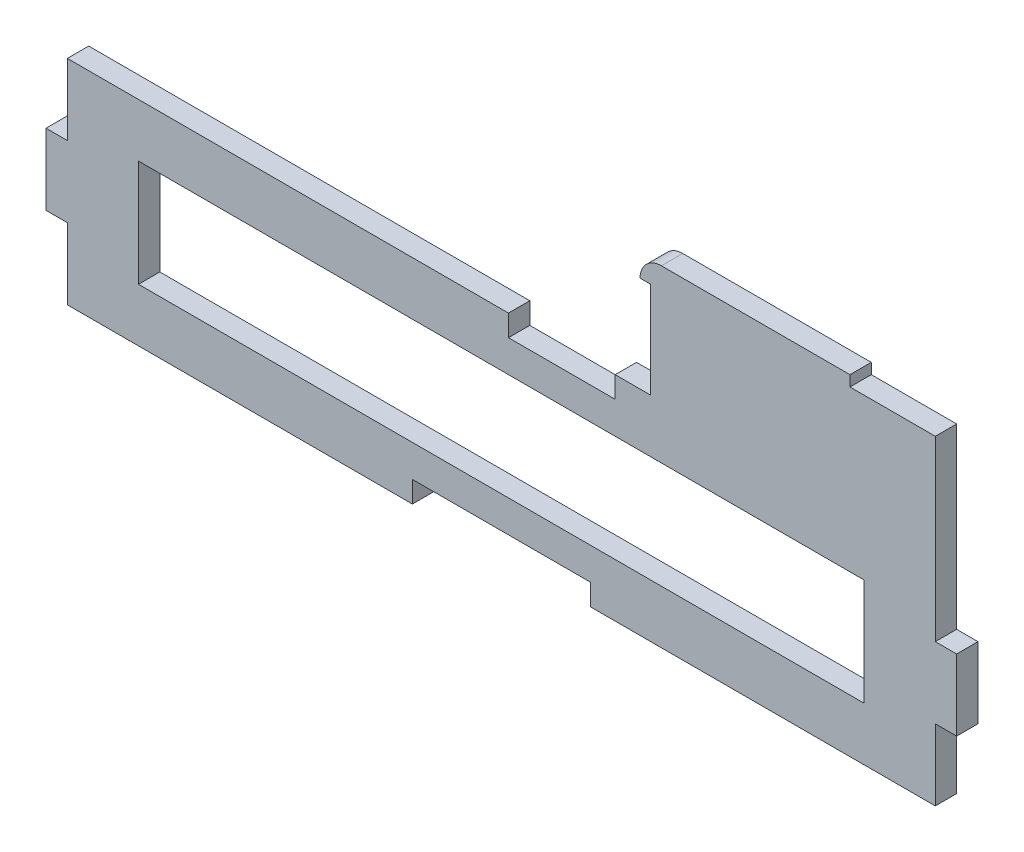
ISO-10303-21;
HEADER;
FILE_DESCRIPTION(('STEP AP214'),'2;1');
FILE_NAME('part.step','',(''),(''),'','','');
FILE_SCHEMA(('AUTOMOTIVE_DESIGN { 1 0 10303 214 1 1 1 1 }'));
ENDSEC;
DATA;
#1=APPLICATION_CONTEXT('core data for automotive mechanical design processes');
#2=APPLICATION_PROTOCOL_DEFINITION('international standard','automotive_design',2000,#1);
#3=PRODUCT_CONTEXT('',#1,'mechanical');
#4=PRODUCT('Part','Part','',(#3));
#5=PRODUCT_RELATED_PRODUCT_CATEGORY('part','',(#4));
#6=PRODUCT_DEFINITION_FORMATION('','',#4);
#7=PRODUCT_DEFINITION_CONTEXT('part definition',#1,'design');
#8=PRODUCT_DEFINITION('design','',#6,#7);
#9=PRODUCT_DEFINITION_SHAPE('','',#8);
#10=(LENGTH_UNIT() NAMED_UNIT(*) SI_UNIT(.MILLI.,.METRE.));
#11=(NAMED_UNIT(*) PLANE_ANGLE_UNIT() SI_UNIT($,.RADIAN.));
#12=(NAMED_UNIT(*) SI_UNIT($,.STERADIAN.) SOLID_ANGLE_UNIT());
#13=UNCERTAINTY_MEASURE_WITH_UNIT(LENGTH_MEASURE(1.E-05),#10,'distance_accuracy_value','');
#14=(GEOMETRIC_REPRESENTATION_CONTEXT(3) GLOBAL_UNCERTAINTY_ASSIGNED_CONTEXT((#13)) GLOBAL_UNIT_ASSIGNED_CONTEXT((#10,
#11,#12)) REPRESENTATION_CONTEXT('',''));
#15=CARTESIAN_POINT('',(0.,0.,0.));
#16=DIRECTION('',(0.,0.,1.));
#17=DIRECTION('',(1.,0.,0.));
#18=AXIS2_PLACEMENT_3D('',#15,#16,#17);
#19=CARTESIAN_POINT('',(167.,87.,6.));
#20=DIRECTION('',(0.,0.,-1.));
#21=DIRECTION('',(-1.,0.,0.));
#22=AXIS2_PLACEMENT_3D('',#19,#20,#21);
#23=CYLINDRICAL_SURFACE('',#22,6.);
#24=DIRECTION('',(0.,0.,-1.));
#25=VECTOR('',#24,1.);
#26=CARTESIAN_POINT('',(161.,87.,6.));
#27=LINE('',#26,#25);
#28=CARTESIAN_POINT('',(161.,87.,6.));
#29=VERTEX_POINT('',#28);
#30=CARTESIAN_POINT('',(161.,87.,0.));
#31=VERTEX_POINT('',#30);
#32=EDGE_CURVE('E490',#29,#31,#27,.T.);
#33=ORIENTED_EDGE('',*,*,#32,.F.);
#34=CARTESIAN_POINT('',(167.,87.,6.));
#35=DIRECTION('',(0.,0.,1.));
#36=DIRECTION('',(1.,0.,0.));
#37=AXIS2_PLACEMENT_3D('',#34,#35,#36);
#38=CIRCLE('',#37,6.);
#39=CARTESIAN_POINT('',(167.,93.,6.));
#40=VERTEX_POINT('',#39);
#41=EDGE_CURVE('E47',#40,#29,#38,.T.);
#42=ORIENTED_EDGE('',*,*,#41,.F.);
#43=DIRECTION('',(0.,0.,-1.));
#44=VECTOR('',#43,1.);
#45=CARTESIAN_POINT('',(167.,93.,6.));
#46=LINE('',#45,#44);
#47=CARTESIAN_POINT('',(167.,93.,0.));
#48=VERTEX_POINT('',#47);
#49=EDGE_CURVE('E542',#48,#40,#46,.F.);
#50=ORIENTED_EDGE('',*,*,#49,.F.);
#51=CARTESIAN_POINT('',(167.,87.,0.));
#52=DIRECTION('',(0.,0.,1.));
#53=DIRECTION('',(1.,0.,0.));
#54=AXIS2_PLACEMENT_3D('',#51,#52,#53);
#55=CIRCLE('',#54,6.);
#56=EDGE_CURVE('E11',#31,#48,#55,.F.);
#57=ORIENTED_EDGE('',*,*,#56,.F.);
#58=EDGE_LOOP('',(#33,#42,#50,#57));
#59=FACE_BOUND('',#58,.T.);
#60=ADVANCED_FACE('F39',(#59),#23,.T.);
#61=CARTESIAN_POINT('',(0.,0.,6.));
#62=DIRECTION('',(0.,0.,1.));
#63=DIRECTION('',(1.,0.,0.));
#64=AXIS2_PLACEMENT_3D('',#61,#62,#63);
#65=PLANE('',#64);
#66=DIRECTION('',(-1.,0.,0.));
#67=VECTOR('',#66,1.);
#68=CARTESIAN_POINT('',(161.,93.,6.));
#69=LINE('',#68,#67);
#70=CARTESIAN_POINT('',(220.,93.,6.));
#71=VERTEX_POINT('',#70);
#72=EDGE_CURVE('E327',#71,#40,#69,.T.);
#73=ORIENTED_EDGE('',*,*,#72,.T.);
#74=ORIENTED_EDGE('',*,*,#41,.T.);
#75=DIRECTION('',(1.,0.,0.));
#76=VECTOR('',#75,1.);
#77=CARTESIAN_POINT('',(164.,87.,6.));
#78=LINE('',#77,#76);
#79=CARTESIAN_POINT('',(164.,87.,6.));
#80=VERTEX_POINT('',#79);
#81=EDGE_CURVE('E331',#29,#80,#78,.T.);
#82=ORIENTED_EDGE('',*,*,#81,.T.);
#83=DIRECTION('',(0.,-1.,0.));
#84=VECTOR('',#83,1.);
#85=CARTESIAN_POINT('',(164.,87.,6.));
#86=LINE('',#85,#84);
#87=CARTESIAN_POINT('',(164.,60.,6.));
#88=VERTEX_POINT('',#87);
#89=EDGE_CURVE('E334',#80,#88,#86,.T.);
#90=ORIENTED_EDGE('',*,*,#89,.T.);
#91=DIRECTION('',(-1.,0.,0.));
#92=VECTOR('',#91,1.);
#93=CARTESIAN_POINT('',(154.,60.,6.));
#94=LINE('',#93,#92);
#95=CARTESIAN_POINT('',(154.,60.,6.));
#96=VERTEX_POINT('',#95);
#97=EDGE_CURVE('E337',#88,#96,#94,.T.);
#98=ORIENTED_EDGE('',*,*,#97,.T.);
#99=DIRECTION('',(0.,-1.,0.));
#100=VECTOR('',#99,1.);
#101=CARTESIAN_POINT('',(154.,60.,6.));
#102=LINE('',#101,#100);
#103=CARTESIAN_POINT('',(154.,54.,6.));
#104=VERTEX_POINT('',#103);
#105=EDGE_CURVE('E340',#96,#104,#102,.T.);
#106=ORIENTED_EDGE('',*,*,#105,.T.);
#107=DIRECTION('',(-1.,0.,0.));
#108=VECTOR('',#107,1.);
#109=CARTESIAN_POINT('',(154.,54.,6.));
#110=LINE('',#109,#108);
#111=CARTESIAN_POINT('',(124.,54.,6.));
#112=VERTEX_POINT('',#111);
#113=EDGE_CURVE('E343',#104,#112,#110,.T.);
#114=ORIENTED_EDGE('',*,*,#113,.T.);
#115=DIRECTION('',(0.,1.,0.));
#116=VECTOR('',#115,1.);
#117=CARTESIAN_POINT('',(124.,54.,6.));
#118=LINE('',#117,#116);
#119=CARTESIAN_POINT('',(124.,60.,6.));
#120=VERTEX_POINT('',#119);
#121=EDGE_CURVE('E346',#112,#120,#118,.T.);
#122=ORIENTED_EDGE('',*,*,#121,.T.);
#123=DIRECTION('',(-1.,0.,0.));
#124=VECTOR('',#123,1.);
#125=CARTESIAN_POINT('',(0.,60.,6.));
#126=LINE('',#125,#124);
#127=CARTESIAN_POINT('',(0.,60.,6.));
#128=VERTEX_POINT('',#127);
#129=EDGE_CURVE('E349',#120,#128,#126,.T.);
#130=ORIENTED_EDGE('',*,*,#129,.T.);
#131=DIRECTION('',(0.,-1.,0.));
#132=VECTOR('',#131,1.);
#133=CARTESIAN_POINT('',(0.,60.,6.));
#134=LINE('',#133,#132);
#135=CARTESIAN_POINT('',(0.,40.,6.));
#136=VERTEX_POINT('',#135);
#137=EDGE_CURVE('E352',#128,#136,#134,.T.);
#138=ORIENTED_EDGE('',*,*,#137,.T.);
#139=DIRECTION('',(-1.,0.,0.));
#140=VECTOR('',#139,1.);
#141=CARTESIAN_POINT('',(0.,40.,6.));
#142=LINE('',#141,#140);
#143=CARTESIAN_POINT('',(-6.,40.,6.));
#144=VERTEX_POINT('',#143);
#145=EDGE_CURVE('E355',#136,#144,#142,.T.);
#146=ORIENTED_EDGE('',*,*,#145,.T.);
#147=DIRECTION('',(0.,-1.,0.));
#148=VECTOR('',#147,1.);
#149=CARTESIAN_POINT('',(-6.,40.,6.));
#150=LINE('',#149,#148);
#151=CARTESIAN_POINT('',(-6.,20.,6.));
#152=VERTEX_POINT('',#151);
#153=EDGE_CURVE('E358',#144,#152,#150,.T.);
#154=ORIENTED_EDGE('',*,*,#153,.T.);
#155=DIRECTION('',(1.,0.,0.));
#156=VECTOR('',#155,1.);
#157=CARTESIAN_POINT('',(0.,20.,6.));
#158=LINE('',#157,#156);
#159=CARTESIAN_POINT('',(0.,20.,6.));
#160=VERTEX_POINT('',#159);
#161=EDGE_CURVE('E361',#152,#160,#158,.T.);
#162=ORIENTED_EDGE('',*,*,#161,.T.);
#163=DIRECTION('',(0.,-1.,0.));
#164=VECTOR('',#163,1.);
#165=CARTESIAN_POINT('',(0.,20.,6.));
#166=LINE('',#165,#164);
#167=CARTESIAN_POINT('',(0.,0.,6.));
#168=VERTEX_POINT('',#167);
#169=EDGE_CURVE('E364',#160,#168,#166,.T.);
#170=ORIENTED_EDGE('',*,*,#169,.T.);
#171=DIRECTION('',(1.,0.,0.));
#172=VECTOR('',#171,1.);
#173=CARTESIAN_POINT('',(0.,0.,6.));
#174=LINE('',#173,#172);
#175=CARTESIAN_POINT('',(97.,0.,6.));
#176=VERTEX_POINT('',#175);
#177=EDGE_CURVE('E289',#168,#176,#174,.T.);
#178=ORIENTED_EDGE('',*,*,#177,.T.);
#179=DIRECTION('',(0.,1.,0.));
#180=VECTOR('',#179,1.);
#181=CARTESIAN_POINT('',(97.,0.,6.));
#182=LINE('',#181,#180);
#183=CARTESIAN_POINT('',(97.,6.,6.));
#184=VERTEX_POINT('',#183);
#185=EDGE_CURVE('E293',#176,#184,#182,.T.);
#186=ORIENTED_EDGE('',*,*,#185,.T.);
#187=DIRECTION('',(1.,0.,0.));
#188=VECTOR('',#187,1.);
#189=CARTESIAN_POINT('',(97.,6.,6.));
#190=LINE('',#189,#188);
#191=CARTESIAN_POINT('',(147.,6.00000000000001,6.));
#192=VERTEX_POINT('',#191);
#193=EDGE_CURVE('E297',#184,#192,#190,.T.);
#194=ORIENTED_EDGE('',*,*,#193,.T.);
#195=DIRECTION('',(0.,-1.,0.));
#196=VECTOR('',#195,1.);
#197=CARTESIAN_POINT('',(147.,6.00000000000001,6.));
#198=LINE('',#197,#196);
#199=CARTESIAN_POINT('',(147.,0.,6.));
#200=VERTEX_POINT('',#199);
#201=EDGE_CURVE('E300',#192,#200,#198,.T.);
#202=ORIENTED_EDGE('',*,*,#201,.T.);
#203=DIRECTION('',(1.,0.,0.));
#204=VECTOR('',#203,1.);
#205=CARTESIAN_POINT('',(147.,0.,6.));
#206=LINE('',#205,#204);
#207=CARTESIAN_POINT('',(244.,0.,6.));
#208=VERTEX_POINT('',#207);
#209=EDGE_CURVE('E303',#200,#208,#206,.T.);
#210=ORIENTED_EDGE('',*,*,#209,.T.);
#211=DIRECTION('',(0.,1.,0.));
#212=VECTOR('',#211,1.);
#213=CARTESIAN_POINT('',(244.,0.,6.));
#214=LINE('',#213,#212);
#215=CARTESIAN_POINT('',(244.,20.,6.));
#216=VERTEX_POINT('',#215);
#217=EDGE_CURVE('E306',#208,#216,#214,.T.);
#218=ORIENTED_EDGE('',*,*,#217,.T.);
#219=DIRECTION('',(1.,0.,0.));
#220=VECTOR('',#219,1.);
#221=CARTESIAN_POINT('',(244.,20.,6.));
#222=LINE('',#221,#220);
#223=CARTESIAN_POINT('',(250.,20.,6.));
#224=VERTEX_POINT('',#223);
#225=EDGE_CURVE('E309',#216,#224,#222,.T.);
#226=ORIENTED_EDGE('',*,*,#225,.T.);
#227=DIRECTION('',(0.,1.,0.));
#228=VECTOR('',#227,1.);
#229=CARTESIAN_POINT('',(250.,40.,6.));
#230=LINE('',#229,#228);
#231=CARTESIAN_POINT('',(250.,40.,6.));
#232=VERTEX_POINT('',#231);
#233=EDGE_CURVE('E312',#224,#232,#230,.T.);
#234=ORIENTED_EDGE('',*,*,#233,.T.);
#235=DIRECTION('',(-1.,0.,0.));
#236=VECTOR('',#235,1.);
#237=CARTESIAN_POINT('',(244.,40.,6.));
#238=LINE('',#237,#236);
#239=CARTESIAN_POINT('',(244.,40.,6.));
#240=VERTEX_POINT('',#239);
#241=EDGE_CURVE('E315',#232,#240,#238,.T.);
#242=ORIENTED_EDGE('',*,*,#241,.T.);
#243=DIRECTION('',(0.,1.,0.));
#244=VECTOR('',#243,1.);
#245=CARTESIAN_POINT('',(244.,90.,6.));
#246=LINE('',#245,#244);
#247=CARTESIAN_POINT('',(244.,90.,6.));
#248=VERTEX_POINT('',#247);
#249=EDGE_CURVE('E318',#240,#248,#246,.T.);
#250=ORIENTED_EDGE('',*,*,#249,.T.);
#251=DIRECTION('',(-1.,0.,0.));
#252=VECTOR('',#251,1.);
#253=CARTESIAN_POINT('',(220.,90.,6.));
#254=LINE('',#253,#252);
#255=CARTESIAN_POINT('',(220.,90.,6.));
#256=VERTEX_POINT('',#255);
#257=EDGE_CURVE('E321',#248,#256,#254,.T.);
#258=ORIENTED_EDGE('',*,*,#257,.T.);
#259=DIRECTION('',(0.,1.,0.));
#260=VECTOR('',#259,1.);
#261=CARTESIAN_POINT('',(220.,93.,6.));
#262=LINE('',#261,#260);
#263=EDGE_CURVE('E324',#256,#71,#262,.T.);
#264=ORIENTED_EDGE('',*,*,#263,.T.);
#265=EDGE_LOOP('',(#73,#74,#82,#90,#98,#106,#114,#122,#130,#138,#146,#154,#162,#170,#178,#186,
#194,#202,#210,#218,#226,#234,#242,#250,#258,#264));
#266=FACE_BOUND('',#265,.T.);
#267=DIRECTION('',(1.,0.,0.));
#268=VECTOR('',#267,1.);
#269=CARTESIAN_POINT('',(20.,15.,6.));
#270=LINE('',#269,#268);
#271=CARTESIAN_POINT('',(20.,15.,6.));
#272=VERTEX_POINT('',#271);
#273=CARTESIAN_POINT('',(224.,15.,6.));
#274=VERTEX_POINT('',#273);
#275=EDGE_CURVE('E246',#272,#274,#270,.T.);
#276=ORIENTED_EDGE('',*,*,#275,.F.);
#277=DIRECTION('',(0.,-1.,0.));
#278=VECTOR('',#277,1.);
#279=CARTESIAN_POINT('',(20.,15.,6.));
#280=LINE('',#279,#278);
#281=CARTESIAN_POINT('',(20.,45.,6.));
#282=VERTEX_POINT('',#281);
#283=EDGE_CURVE('E235',#282,#272,#280,.T.);
#284=ORIENTED_EDGE('',*,*,#283,.F.);
#285=DIRECTION('',(-1.,0.,0.));
#286=VECTOR('',#285,1.);
#287=CARTESIAN_POINT('',(20.,45.,6.));
#288=LINE('',#287,#286);
#289=CARTESIAN_POINT('',(224.,45.,6.));
#290=VERTEX_POINT('',#289);
#291=EDGE_CURVE('E265',#290,#282,#288,.T.);
#292=ORIENTED_EDGE('',*,*,#291,.F.);
#293=DIRECTION('',(0.,1.,0.));
#294=VECTOR('',#293,1.);
#295=CARTESIAN_POINT('',(224.,15.,6.));
#296=LINE('',#295,#294);
#297=EDGE_CURVE('E261',#274,#290,#296,.T.);
#298=ORIENTED_EDGE('',*,*,#297,.F.);
#299=EDGE_LOOP('',(#276,#284,#292,#298));
#300=FACE_BOUND('',#299,.T.);
#301=ADVANCED_FACE('F259',(#266,#300),#65,.T.);
#302=CARTESIAN_POINT('',(0.,0.,0.));
#303=DIRECTION('',(0.,0.,1.));
#304=DIRECTION('',(1.,0.,0.));
#305=AXIS2_PLACEMENT_3D('',#302,#303,#304);
#306=PLANE('',#305);
#307=DIRECTION('',(1.,0.,0.));
#308=VECTOR('',#307,1.);
#309=CARTESIAN_POINT('',(164.,87.,0.));
#310=LINE('',#309,#308);
#311=CARTESIAN_POINT('',(164.,87.,0.));
#312=VERTEX_POINT('',#311);
#313=EDGE_CURVE('E408',#31,#312,#310,.T.);
#314=ORIENTED_EDGE('',*,*,#313,.F.);
#315=ORIENTED_EDGE('',*,*,#56,.T.);
#316=DIRECTION('',(-1.,0.,0.));
#317=VECTOR('',#316,1.);
#318=CARTESIAN_POINT('',(161.,93.,0.));
#319=LINE('',#318,#317);
#320=CARTESIAN_POINT('',(220.,93.,0.));
#321=VERTEX_POINT('',#320);
#322=EDGE_CURVE('E404',#321,#48,#319,.T.);
#323=ORIENTED_EDGE('',*,*,#322,.F.);
#324=DIRECTION('',(0.,1.,0.));
#325=VECTOR('',#324,1.);
#326=CARTESIAN_POINT('',(220.,93.,0.));
#327=LINE('',#326,#325);
#328=CARTESIAN_POINT('',(220.,90.,0.));
#329=VERTEX_POINT('',#328);
#330=EDGE_CURVE('E401',#329,#321,#327,.T.);
#331=ORIENTED_EDGE('',*,*,#330,.F.);
#332=DIRECTION('',(-1.,0.,0.));
#333=VECTOR('',#332,1.);
#334=CARTESIAN_POINT('',(220.,90.,0.));
#335=LINE('',#334,#333);
#336=CARTESIAN_POINT('',(244.,90.,0.));
#337=VERTEX_POINT('',#336);
#338=EDGE_CURVE('E398',#337,#329,#335,.T.);
#339=ORIENTED_EDGE('',*,*,#338,.F.);
#340=DIRECTION('',(0.,1.,0.));
#341=VECTOR('',#340,1.);
#342=CARTESIAN_POINT('',(244.,90.,0.));
#343=LINE('',#342,#341);
#344=CARTESIAN_POINT('',(244.,40.,0.));
#345=VERTEX_POINT('',#344);
#346=EDGE_CURVE('E395',#345,#337,#343,.T.);
#347=ORIENTED_EDGE('',*,*,#346,.F.);
#348=DIRECTION('',(-1.,0.,0.));
#349=VECTOR('',#348,1.);
#350=CARTESIAN_POINT('',(244.,40.,0.));
#351=LINE('',#350,#349);
#352=CARTESIAN_POINT('',(250.,40.,0.));
#353=VERTEX_POINT('',#352);
#354=EDGE_CURVE('E392',#353,#345,#351,.T.);
#355=ORIENTED_EDGE('',*,*,#354,.F.);
#356=DIRECTION('',(0.,1.,0.));
#357=VECTOR('',#356,1.);
#358=CARTESIAN_POINT('',(250.,40.,0.));
#359=LINE('',#358,#357);
#360=CARTESIAN_POINT('',(250.,20.,0.));
#361=VERTEX_POINT('',#360);
#362=EDGE_CURVE('E389',#361,#353,#359,.T.);
#363=ORIENTED_EDGE('',*,*,#362,.F.);
#364=DIRECTION('',(1.,0.,0.));
#365=VECTOR('',#364,1.);
#366=CARTESIAN_POINT('',(244.,20.,0.));
#367=LINE('',#366,#365);
#368=CARTESIAN_POINT('',(244.,20.,0.));
#369=VERTEX_POINT('',#368);
#370=EDGE_CURVE('E386',#369,#361,#367,.T.);
#371=ORIENTED_EDGE('',*,*,#370,.F.);
#372=DIRECTION('',(0.,1.,0.));
#373=VECTOR('',#372,1.);
#374=CARTESIAN_POINT('',(244.,0.,0.));
#375=LINE('',#374,#373);
#376=CARTESIAN_POINT('',(244.,0.,0.));
#377=VERTEX_POINT('',#376);
#378=EDGE_CURVE('E383',#377,#369,#375,.T.);
#379=ORIENTED_EDGE('',*,*,#378,.F.);
#380=DIRECTION('',(1.,0.,0.));
#381=VECTOR('',#380,1.);
#382=CARTESIAN_POINT('',(147.,0.,0.));
#383=LINE('',#382,#381);
#384=CARTESIAN_POINT('',(147.,0.,0.));
#385=VERTEX_POINT('',#384);
#386=EDGE_CURVE('E380',#385,#377,#383,.T.);
#387=ORIENTED_EDGE('',*,*,#386,.F.);
#388=DIRECTION('',(0.,-1.,0.));
#389=VECTOR('',#388,1.);
#390=CARTESIAN_POINT('',(147.,6.00000000000001,0.));
#391=LINE('',#390,#389);
#392=CARTESIAN_POINT('',(147.,6.00000000000001,0.));
#393=VERTEX_POINT('',#392);
#394=EDGE_CURVE('E377',#393,#385,#391,.T.);
#395=ORIENTED_EDGE('',*,*,#394,.F.);
#396=DIRECTION('',(1.,0.,0.));
#397=VECTOR('',#396,1.);
#398=CARTESIAN_POINT('',(97.,6.,0.));
#399=LINE('',#398,#397);
#400=CARTESIAN_POINT('',(97.,6.,0.));
#401=VERTEX_POINT('',#400);
#402=EDGE_CURVE('E374',#401,#393,#399,.T.);
#403=ORIENTED_EDGE('',*,*,#402,.F.);
#404=DIRECTION('',(0.,1.,0.));
#405=VECTOR('',#404,1.);
#406=CARTESIAN_POINT('',(97.,0.,0.));
#407=LINE('',#406,#405);
#408=CARTESIAN_POINT('',(97.,0.,0.));
#409=VERTEX_POINT('',#408);
#410=EDGE_CURVE('E371',#409,#401,#407,.T.);
#411=ORIENTED_EDGE('',*,*,#410,.F.);
#412=DIRECTION('',(1.,0.,0.));
#413=VECTOR('',#412,1.);
#414=CARTESIAN_POINT('',(0.,0.,0.));
#415=LINE('',#414,#413);
#416=CARTESIAN_POINT('',(0.,0.,0.));
#417=VERTEX_POINT('',#416);
#418=EDGE_CURVE('E255',#417,#409,#415,.T.);
#419=ORIENTED_EDGE('',*,*,#418,.F.);
#420=DIRECTION('',(0.,-1.,0.));
#421=VECTOR('',#420,1.);
#422=CARTESIAN_POINT('',(0.,20.,0.));
#423=LINE('',#422,#421);
#424=CARTESIAN_POINT('',(0.,20.,0.));
#425=VERTEX_POINT('',#424);
#426=EDGE_CURVE('E294',#425,#417,#423,.T.);
#427=ORIENTED_EDGE('',*,*,#426,.F.);
#428=DIRECTION('',(1.,0.,0.));
#429=VECTOR('',#428,1.);
#430=CARTESIAN_POINT('',(0.,20.,0.));
#431=LINE('',#430,#429);
#432=CARTESIAN_POINT('',(-6.,20.,0.));
#433=VERTEX_POINT('',#432);
#434=EDGE_CURVE('E438',#433,#425,#431,.T.);
#435=ORIENTED_EDGE('',*,*,#434,.F.);
#436=DIRECTION('',(0.,-1.,0.));
#437=VECTOR('',#436,1.);
#438=CARTESIAN_POINT('',(-6.,40.,0.));
#439=LINE('',#438,#437);
#440=CARTESIAN_POINT('',(-6.,40.,0.));
#441=VERTEX_POINT('',#440);
#442=EDGE_CURVE('E435',#441,#433,#439,.T.);
#443=ORIENTED_EDGE('',*,*,#442,.F.);
#444=DIRECTION('',(-1.,0.,0.));
#445=VECTOR('',#444,1.);
#446=CARTESIAN_POINT('',(0.,40.,0.));
#447=LINE('',#446,#445);
#448=CARTESIAN_POINT('',(0.,40.,0.));
#449=VERTEX_POINT('',#448);
#450=EDGE_CURVE('E432',#449,#441,#447,.T.);
#451=ORIENTED_EDGE('',*,*,#450,.F.);
#452=DIRECTION('',(0.,-1.,0.));
#453=VECTOR('',#452,1.);
#454=CARTESIAN_POINT('',(0.,60.,0.));
#455=LINE('',#454,#453);
#456=CARTESIAN_POINT('',(0.,60.,0.));
#457=VERTEX_POINT('',#456);
#458=EDGE_CURVE('E429',#457,#449,#455,.T.);
#459=ORIENTED_EDGE('',*,*,#458,.F.);
#460=DIRECTION('',(-1.,0.,0.));
#461=VECTOR('',#460,1.);
#462=CARTESIAN_POINT('',(0.,60.,0.));
#463=LINE('',#462,#461);
#464=CARTESIAN_POINT('',(124.,60.,0.));
#465=VERTEX_POINT('',#464);
#466=EDGE_CURVE('E426',#465,#457,#463,.T.);
#467=ORIENTED_EDGE('',*,*,#466,.F.);
#468=DIRECTION('',(0.,1.,0.));
#469=VECTOR('',#468,1.);
#470=CARTESIAN_POINT('',(124.,54.,0.));
#471=LINE('',#470,#469);
#472=CARTESIAN_POINT('',(124.,54.,0.));
#473=VERTEX_POINT('',#472);
#474=EDGE_CURVE('E423',#473,#465,#471,.T.);
#475=ORIENTED_EDGE('',*,*,#474,.F.);
#476=DIRECTION('',(-1.,0.,0.));
#477=VECTOR('',#476,1.);
#478=CARTESIAN_POINT('',(154.,54.,0.));
#479=LINE('',#478,#477);
#480=CARTESIAN_POINT('',(154.,54.,0.));
#481=VERTEX_POINT('',#480);
#482=EDGE_CURVE('E420',#481,#473,#479,.T.);
#483=ORIENTED_EDGE('',*,*,#482,.F.);
#484=DIRECTION('',(0.,-1.,0.));
#485=VECTOR('',#484,1.);
#486=CARTESIAN_POINT('',(154.,60.,0.));
#487=LINE('',#486,#485);
#488=CARTESIAN_POINT('',(154.,60.,0.));
#489=VERTEX_POINT('',#488);
#490=EDGE_CURVE('E417',#489,#481,#487,.T.);
#491=ORIENTED_EDGE('',*,*,#490,.F.);
#492=DIRECTION('',(-1.,0.,0.));
#493=VECTOR('',#492,1.);
#494=CARTESIAN_POINT('',(154.,60.,0.));
#495=LINE('',#494,#493);
#496=CARTESIAN_POINT('',(164.,60.,0.));
#497=VERTEX_POINT('',#496);
#498=EDGE_CURVE('E414',#497,#489,#495,.T.);
#499=ORIENTED_EDGE('',*,*,#498,.F.);
#500=DIRECTION('',(0.,-1.,0.));
#501=VECTOR('',#500,1.);
#502=CARTESIAN_POINT('',(164.,87.,0.));
#503=LINE('',#502,#501);
#504=EDGE_CURVE('E411',#312,#497,#503,.T.);
#505=ORIENTED_EDGE('',*,*,#504,.F.);
#506=EDGE_LOOP('',(#314,#315,#323,#331,#339,#347,#355,#363,#371,#379,#387,#395,#403,#411,#419,
#427,#435,#443,#451,#459,#467,#475,#483,#491,#499,#505));
#507=FACE_BOUND('',#506,.T.);
#508=DIRECTION('',(0.,-1.,0.));
#509=VECTOR('',#508,1.);
#510=CARTESIAN_POINT('',(20.,15.,0.));
#511=LINE('',#510,#509);
#512=CARTESIAN_POINT('',(20.,45.,0.));
#513=VERTEX_POINT('',#512);
#514=CARTESIAN_POINT('',(20.,15.,0.));
#515=VERTEX_POINT('',#514);
#516=EDGE_CURVE('E270',#513,#515,#511,.T.);
#517=ORIENTED_EDGE('',*,*,#516,.T.);
#518=DIRECTION('',(1.,0.,0.));
#519=VECTOR('',#518,1.);
#520=CARTESIAN_POINT('',(20.,15.,0.));
#521=LINE('',#520,#519);
#522=CARTESIAN_POINT('',(224.,15.,0.));
#523=VERTEX_POINT('',#522);
#524=EDGE_CURVE('E253',#515,#523,#521,.T.);
#525=ORIENTED_EDGE('',*,*,#524,.T.);
#526=DIRECTION('',(0.,1.,0.));
#527=VECTOR('',#526,1.);
#528=CARTESIAN_POINT('',(224.,15.,0.));
#529=LINE('',#528,#527);
#530=CARTESIAN_POINT('',(224.,45.,0.));
#531=VERTEX_POINT('',#530);
#532=EDGE_CURVE('E275',#523,#531,#529,.T.);
#533=ORIENTED_EDGE('',*,*,#532,.T.);
#534=DIRECTION('',(-1.,0.,0.));
#535=VECTOR('',#534,1.);
#536=CARTESIAN_POINT('',(20.,45.,0.));
#537=LINE('',#536,#535);
#538=EDGE_CURVE('E247',#531,#513,#537,.T.);
#539=ORIENTED_EDGE('',*,*,#538,.T.);
#540=EDGE_LOOP('',(#517,#525,#533,#539));
#541=FACE_BOUND('',#540,.T.);
#542=ADVANCED_FACE('F666',(#507,#541),#306,.F.);
#543=CARTESIAN_POINT('',(0.,0.,6.));
#544=DIRECTION('',(0.,1.,0.));
#545=DIRECTION('',(0.,0.,1.));
#546=AXIS2_PLACEMENT_3D('',#543,#544,#545);
#547=PLANE('',#546);
#548=ORIENTED_EDGE('',*,*,#418,.T.);
#549=DIRECTION('',(0.,0.,-1.));
#550=VECTOR('',#549,1.);
#551=CARTESIAN_POINT('',(97.,0.,6.));
#552=LINE('',#551,#550);
#553=EDGE_CURVE('E538',#176,#409,#552,.T.);
#554=ORIENTED_EDGE('',*,*,#553,.F.);
#555=ORIENTED_EDGE('',*,*,#177,.F.);
#556=DIRECTION('',(0.,0.,-1.));
#557=VECTOR('',#556,1.);
#558=CARTESIAN_POINT('',(0.,0.,6.));
#559=LINE('',#558,#557);
#560=EDGE_CURVE('E367',#168,#417,#559,.T.);
#561=ORIENTED_EDGE('',*,*,#560,.T.);
#562=EDGE_LOOP('',(#548,#554,#555,#561));
#563=FACE_BOUND('',#562,.T.);
#564=ADVANCED_FACE('F610',(#563),#547,.F.);
#565=CARTESIAN_POINT('',(97.,0.,6.));
#566=DIRECTION('',(-1.,0.,0.));
#567=DIRECTION('',(0.,0.,1.));
#568=AXIS2_PLACEMENT_3D('',#565,#566,#567);
#569=PLANE('',#568);
#570=ORIENTED_EDGE('',*,*,#410,.T.);
#571=DIRECTION('',(0.,0.,-1.));
#572=VECTOR('',#571,1.);
#573=CARTESIAN_POINT('',(97.,6.,6.));
#574=LINE('',#573,#572);
#575=EDGE_CURVE('E534',#184,#401,#574,.T.);
#576=ORIENTED_EDGE('',*,*,#575,.F.);
#577=ORIENTED_EDGE('',*,*,#185,.F.);
#578=ORIENTED_EDGE('',*,*,#553,.T.);
#579=EDGE_LOOP('',(#570,#576,#577,#578));
#580=FACE_BOUND('',#579,.T.);
#581=ADVANCED_FACE('F612',(#580),#569,.F.);
#582=CARTESIAN_POINT('',(97.,6.,6.));
#583=DIRECTION('',(0.,1.,0.));
#584=DIRECTION('',(-1.,0.,0.));
#585=AXIS2_PLACEMENT_3D('',#582,#583,#584);
#586=PLANE('',#585);
#587=ORIENTED_EDGE('',*,*,#402,.T.);
#588=DIRECTION('',(0.,0.,-1.));
#589=VECTOR('',#588,1.);
#590=CARTESIAN_POINT('',(147.,6.00000000000001,6.));
#591=LINE('',#590,#589);
#592=EDGE_CURVE('E530',#192,#393,#591,.T.);
#593=ORIENTED_EDGE('',*,*,#592,.F.);
#594=ORIENTED_EDGE('',*,*,#193,.F.);
#595=ORIENTED_EDGE('',*,*,#575,.T.);
#596=EDGE_LOOP('',(#587,#593,#594,#595));
#597=FACE_BOUND('',#596,.T.);
#598=ADVANCED_FACE('F619',(#597),#586,.F.);
#599=CARTESIAN_POINT('',(147.,6.00000000000001,6.));
#600=DIRECTION('',(1.,0.,0.));
#601=DIRECTION('',(0.,0.,-1.));
#602=AXIS2_PLACEMENT_3D('',#599,#600,#601);
#603=PLANE('',#602);
#604=ORIENTED_EDGE('',*,*,#394,.T.);
#605=DIRECTION('',(0.,0.,-1.));
#606=VECTOR('',#605,1.);
#607=CARTESIAN_POINT('',(147.,0.,6.));
#608=LINE('',#607,#606);
#609=EDGE_CURVE('E526',#200,#385,#608,.T.);
#610=ORIENTED_EDGE('',*,*,#609,.F.);
#611=ORIENTED_EDGE('',*,*,#201,.F.);
#612=ORIENTED_EDGE('',*,*,#592,.T.);
#613=EDGE_LOOP('',(#604,#610,#611,#612));
#614=FACE_BOUND('',#613,.T.);
#615=ADVANCED_FACE('F623',(#614),#603,.F.);
#616=CARTESIAN_POINT('',(147.,0.,6.));
#617=DIRECTION('',(0.,1.,0.));
#618=DIRECTION('',(-1.,0.,0.));
#619=AXIS2_PLACEMENT_3D('',#616,#617,#618);
#620=PLANE('',#619);
#621=ORIENTED_EDGE('',*,*,#386,.T.);
#622=DIRECTION('',(0.,0.,-1.));
#623=VECTOR('',#622,1.);
#624=CARTESIAN_POINT('',(244.,0.,6.));
#625=LINE('',#624,#623);
#626=EDGE_CURVE('E522',#208,#377,#625,.T.);
#627=ORIENTED_EDGE('',*,*,#626,.F.);
#628=ORIENTED_EDGE('',*,*,#209,.F.);
#629=ORIENTED_EDGE('',*,*,#609,.T.);
#630=EDGE_LOOP('',(#621,#627,#628,#629));
#631=FACE_BOUND('',#630,.T.);
#632=ADVANCED_FACE('F628',(#631),#620,.F.);
#633=CARTESIAN_POINT('',(244.,0.,6.));
#634=DIRECTION('',(-1.,0.,0.));
#635=DIRECTION('',(0.,0.,1.));
#636=AXIS2_PLACEMENT_3D('',#633,#634,#635);
#637=PLANE('',#636);
#638=ORIENTED_EDGE('',*,*,#378,.T.);
#639=DIRECTION('',(0.,0.,-1.));
#640=VECTOR('',#639,1.);
#641=CARTESIAN_POINT('',(244.,20.,6.));
#642=LINE('',#641,#640);
#643=EDGE_CURVE('E518',#216,#369,#642,.T.);
#644=ORIENTED_EDGE('',*,*,#643,.F.);
#645=ORIENTED_EDGE('',*,*,#217,.F.);
#646=ORIENTED_EDGE('',*,*,#626,.T.);
#647=EDGE_LOOP('',(#638,#644,#645,#646));
#648=FACE_BOUND('',#647,.T.);
#649=ADVANCED_FACE('F634',(#648),#637,.F.);
#650=CARTESIAN_POINT('',(244.,20.,6.));
#651=DIRECTION('',(0.,1.,0.));
#652=DIRECTION('',(0.,0.,1.));
#653=AXIS2_PLACEMENT_3D('',#650,#651,#652);
#654=PLANE('',#653);
#655=ORIENTED_EDGE('',*,*,#370,.T.);
#656=DIRECTION('',(0.,0.,-1.));
#657=VECTOR('',#656,1.);
#658=CARTESIAN_POINT('',(250.,20.,6.));
#659=LINE('',#658,#657);
#660=EDGE_CURVE('E514',#224,#361,#659,.T.);
#661=ORIENTED_EDGE('',*,*,#660,.F.);
#662=ORIENTED_EDGE('',*,*,#225,.F.);
#663=ORIENTED_EDGE('',*,*,#643,.T.);
#664=EDGE_LOOP('',(#655,#661,#662,#663));
#665=FACE_BOUND('',#664,.T.);
#666=ADVANCED_FACE('F638',(#665),#654,.F.);
#667=CARTESIAN_POINT('',(250.,40.,6.));
#668=DIRECTION('',(-1.,0.,0.));
#669=DIRECTION('',(0.,0.,1.));
#670=AXIS2_PLACEMENT_3D('',#667,#668,#669);
#671=PLANE('',#670);
#672=ORIENTED_EDGE('',*,*,#362,.T.);
#673=DIRECTION('',(0.,0.,-1.));
#674=VECTOR('',#673,1.);
#675=CARTESIAN_POINT('',(250.,40.,6.));
#676=LINE('',#675,#674);
#677=EDGE_CURVE('E510',#232,#353,#676,.T.);
#678=ORIENTED_EDGE('',*,*,#677,.F.);
#679=ORIENTED_EDGE('',*,*,#233,.F.);
#680=ORIENTED_EDGE('',*,*,#660,.T.);
#681=EDGE_LOOP('',(#672,#678,#679,#680));
#682=FACE_BOUND('',#681,.T.);
#683=ADVANCED_FACE('F643',(#682),#671,.F.);
#684=CARTESIAN_POINT('',(244.,40.,6.));
#685=DIRECTION('',(0.,-1.,0.));
#686=DIRECTION('',(0.,0.,-1.));
#687=AXIS2_PLACEMENT_3D('',#684,#685,#686);
#688=PLANE('',#687);
#689=ORIENTED_EDGE('',*,*,#354,.T.);
#690=DIRECTION('',(0.,0.,-1.));
#691=VECTOR('',#690,1.);
#692=CARTESIAN_POINT('',(244.,40.,6.));
#693=LINE('',#692,#691);
#694=EDGE_CURVE('E506',#240,#345,#693,.T.);
#695=ORIENTED_EDGE('',*,*,#694,.F.);
#696=ORIENTED_EDGE('',*,*,#241,.F.);
#697=ORIENTED_EDGE('',*,*,#677,.T.);
#698=EDGE_LOOP('',(#689,#695,#696,#697));
#699=FACE_BOUND('',#698,.T.);
#700=ADVANCED_FACE('F649',(#699),#688,.F.);
#701=CARTESIAN_POINT('',(244.,90.,6.));
#702=DIRECTION('',(-1.,0.,0.));
#703=DIRECTION('',(0.,0.,1.));
#704=AXIS2_PLACEMENT_3D('',#701,#702,#703);
#705=PLANE('',#704);
#706=ORIENTED_EDGE('',*,*,#346,.T.);
#707=DIRECTION('',(0.,0.,-1.));
#708=VECTOR('',#707,1.);
#709=CARTESIAN_POINT('',(244.,90.,6.));
#710=LINE('',#709,#708);
#711=EDGE_CURVE('E502',#248,#337,#710,.T.);
#712=ORIENTED_EDGE('',*,*,#711,.F.);
#713=ORIENTED_EDGE('',*,*,#249,.F.);
#714=ORIENTED_EDGE('',*,*,#694,.T.);
#715=EDGE_LOOP('',(#706,#712,#713,#714));
#716=FACE_BOUND('',#715,.T.);
#717=ADVANCED_FACE('F653',(#716),#705,.F.);
#718=CARTESIAN_POINT('',(220.,90.,6.));
#719=DIRECTION('',(0.,-1.,0.));
#720=DIRECTION('',(0.,0.,-1.));
#721=AXIS2_PLACEMENT_3D('',#718,#719,#720);
#722=PLANE('',#721);
#723=ORIENTED_EDGE('',*,*,#338,.T.);
#724=DIRECTION('',(0.,0.,-1.));
#725=VECTOR('',#724,1.);
#726=CARTESIAN_POINT('',(220.,90.,6.));
#727=LINE('',#726,#725);
#728=EDGE_CURVE('E498',#256,#329,#727,.T.);
#729=ORIENTED_EDGE('',*,*,#728,.F.);
#730=ORIENTED_EDGE('',*,*,#257,.F.);
#731=ORIENTED_EDGE('',*,*,#711,.T.);
#732=EDGE_LOOP('',(#723,#729,#730,#731));
#733=FACE_BOUND('',#732,.T.);
#734=ADVANCED_FACE('F658',(#733),#722,.F.);
#735=CARTESIAN_POINT('',(220.,93.,6.));
#736=DIRECTION('',(-1.,0.,0.));
#737=DIRECTION('',(0.,0.,1.));
#738=AXIS2_PLACEMENT_3D('',#735,#736,#737);
#739=PLANE('',#738);
#740=ORIENTED_EDGE('',*,*,#330,.T.);
#741=DIRECTION('',(0.,0.,-1.));
#742=VECTOR('',#741,1.);
#743=CARTESIAN_POINT('',(220.,93.,6.));
#744=LINE('',#743,#742);
#745=EDGE_CURVE('E494',#71,#321,#744,.T.);
#746=ORIENTED_EDGE('',*,*,#745,.F.);
#747=ORIENTED_EDGE('',*,*,#263,.F.);
#748=ORIENTED_EDGE('',*,*,#728,.T.);
#749=EDGE_LOOP('',(#740,#746,#747,#748));
#750=FACE_BOUND('',#749,.T.);
#751=ADVANCED_FACE('F662',(#750),#739,.F.);
#752=CARTESIAN_POINT('',(161.,93.,6.));
#753=DIRECTION('',(0.,-1.,0.));
#754=DIRECTION('',(1.,0.,0.));
#755=AXIS2_PLACEMENT_3D('',#752,#753,#754);
#756=PLANE('',#755);
#757=ORIENTED_EDGE('',*,*,#322,.T.);
#758=ORIENTED_EDGE('',*,*,#49,.T.);
#759=ORIENTED_EDGE('',*,*,#72,.F.);
#760=ORIENTED_EDGE('',*,*,#745,.T.);
#761=EDGE_LOOP('',(#757,#758,#759,#760));
#762=FACE_BOUND('',#761,.T.);
#763=ADVANCED_FACE('F665',(#762),#756,.F.);
#764=CARTESIAN_POINT('',(164.,87.,6.));
#765=DIRECTION('',(0.,1.,0.));
#766=DIRECTION('',(0.,0.,1.));
#767=AXIS2_PLACEMENT_3D('',#764,#765,#766);
#768=PLANE('',#767);
#769=ORIENTED_EDGE('',*,*,#313,.T.);
#770=DIRECTION('',(0.,0.,-1.));
#771=VECTOR('',#770,1.);
#772=CARTESIAN_POINT('',(164.,87.,6.));
#773=LINE('',#772,#771);
#774=EDGE_CURVE('E486',#80,#312,#773,.T.);
#775=ORIENTED_EDGE('',*,*,#774,.F.);
#776=ORIENTED_EDGE('',*,*,#81,.F.);
#777=ORIENTED_EDGE('',*,*,#32,.T.);
#778=EDGE_LOOP('',(#769,#775,#776,#777));
#779=FACE_BOUND('',#778,.T.);
#780=ADVANCED_FACE('F550',(#779),#768,.F.);
#781=CARTESIAN_POINT('',(164.,87.,6.));
#782=DIRECTION('',(1.,0.,0.));
#783=DIRECTION('',(0.,0.,-1.));
#784=AXIS2_PLACEMENT_3D('',#781,#782,#783);
#785=PLANE('',#784);
#786=ORIENTED_EDGE('',*,*,#504,.T.);
#787=DIRECTION('',(0.,0.,-1.));
#788=VECTOR('',#787,1.);
#789=CARTESIAN_POINT('',(164.,60.,6.));
#790=LINE('',#789,#788);
#791=EDGE_CURVE('E482',#88,#497,#790,.T.);
#792=ORIENTED_EDGE('',*,*,#791,.F.);
#793=ORIENTED_EDGE('',*,*,#89,.F.);
#794=ORIENTED_EDGE('',*,*,#774,.T.);
#795=EDGE_LOOP('',(#786,#792,#793,#794));
#796=FACE_BOUND('',#795,.T.);
#797=ADVANCED_FACE('F555',(#796),#785,.F.);
#798=CARTESIAN_POINT('',(154.,60.,6.));
#799=DIRECTION('',(0.,-1.,0.));
#800=DIRECTION('',(0.,0.,-1.));
#801=AXIS2_PLACEMENT_3D('',#798,#799,#800);
#802=PLANE('',#801);
#803=ORIENTED_EDGE('',*,*,#498,.T.);
#804=DIRECTION('',(0.,0.,-1.));
#805=VECTOR('',#804,1.);
#806=CARTESIAN_POINT('',(154.,60.,6.));
#807=LINE('',#806,#805);
#808=EDGE_CURVE('E478',#96,#489,#807,.T.);
#809=ORIENTED_EDGE('',*,*,#808,.F.);
#810=ORIENTED_EDGE('',*,*,#97,.F.);
#811=ORIENTED_EDGE('',*,*,#791,.T.);
#812=EDGE_LOOP('',(#803,#809,#810,#811));
#813=FACE_BOUND('',#812,.T.);
#814=ADVANCED_FACE('F561',(#813),#802,.F.);
#815=CARTESIAN_POINT('',(154.,60.,6.));
#816=DIRECTION('',(1.,0.,0.));
#817=DIRECTION('',(0.,0.,-1.));
#818=AXIS2_PLACEMENT_3D('',#815,#816,#817);
#819=PLANE('',#818);
#820=ORIENTED_EDGE('',*,*,#490,.T.);
#821=DIRECTION('',(0.,0.,-1.));
#822=VECTOR('',#821,1.);
#823=CARTESIAN_POINT('',(154.,54.,6.));
#824=LINE('',#823,#822);
#825=EDGE_CURVE('E474',#104,#481,#824,.T.);
#826=ORIENTED_EDGE('',*,*,#825,.F.);
#827=ORIENTED_EDGE('',*,*,#105,.F.);
#828=ORIENTED_EDGE('',*,*,#808,.T.);
#829=EDGE_LOOP('',(#820,#826,#827,#828));
#830=FACE_BOUND('',#829,.T.);
#831=ADVANCED_FACE('F565',(#830),#819,.F.);
#832=CARTESIAN_POINT('',(154.,54.,6.));
#833=DIRECTION('',(0.,-1.,0.));
#834=DIRECTION('',(1.,0.,0.));
#835=AXIS2_PLACEMENT_3D('',#832,#833,#834);
#836=PLANE('',#835);
#837=ORIENTED_EDGE('',*,*,#482,.T.);
#838=DIRECTION('',(0.,0.,-1.));
#839=VECTOR('',#838,1.);
#840=CARTESIAN_POINT('',(124.,54.,6.));
#841=LINE('',#840,#839);
#842=EDGE_CURVE('E470',#112,#473,#841,.T.);
#843=ORIENTED_EDGE('',*,*,#842,.F.);
#844=ORIENTED_EDGE('',*,*,#113,.F.);
#845=ORIENTED_EDGE('',*,*,#825,.T.);
#846=EDGE_LOOP('',(#837,#843,#844,#845));
#847=FACE_BOUND('',#846,.T.);
#848=ADVANCED_FACE('F570',(#847),#836,.F.);
#849=CARTESIAN_POINT('',(124.,54.,6.));
#850=DIRECTION('',(-1.,0.,0.));
#851=DIRECTION('',(0.,-1.,0.));
#852=AXIS2_PLACEMENT_3D('',#849,#850,#851);
#853=PLANE('',#852);
#854=ORIENTED_EDGE('',*,*,#474,.T.);
#855=DIRECTION('',(0.,0.,-1.));
#856=VECTOR('',#855,1.);
#857=CARTESIAN_POINT('',(124.,60.,6.));
#858=LINE('',#857,#856);
#859=EDGE_CURVE('E466',#120,#465,#858,.T.);
#860=ORIENTED_EDGE('',*,*,#859,.F.);
#861=ORIENTED_EDGE('',*,*,#121,.F.);
#862=ORIENTED_EDGE('',*,*,#842,.T.);
#863=EDGE_LOOP('',(#854,#860,#861,#862));
#864=FACE_BOUND('',#863,.T.);
#865=ADVANCED_FACE('F576',(#864),#853,.F.);
#866=CARTESIAN_POINT('',(0.,60.,6.));
#867=DIRECTION('',(0.,-1.,0.));
#868=DIRECTION('',(0.,0.,-1.));
#869=AXIS2_PLACEMENT_3D('',#866,#867,#868);
#870=PLANE('',#869);
#871=ORIENTED_EDGE('',*,*,#466,.T.);
#872=DIRECTION('',(0.,0.,-1.));
#873=VECTOR('',#872,1.);
#874=CARTESIAN_POINT('',(0.,60.,6.));
#875=LINE('',#874,#873);
#876=EDGE_CURVE('E462',#128,#457,#875,.T.);
#877=ORIENTED_EDGE('',*,*,#876,.F.);
#878=ORIENTED_EDGE('',*,*,#129,.F.);
#879=ORIENTED_EDGE('',*,*,#859,.T.);
#880=EDGE_LOOP('',(#871,#877,#878,#879));
#881=FACE_BOUND('',#880,.T.);
#882=ADVANCED_FACE('F580',(#881),#870,.F.);
#883=CARTESIAN_POINT('',(0.,60.,6.));
#884=DIRECTION('',(1.,0.,0.));
#885=DIRECTION('',(0.,1.,0.));
#886=AXIS2_PLACEMENT_3D('',#883,#884,#885);
#887=PLANE('',#886);
#888=ORIENTED_EDGE('',*,*,#458,.T.);
#889=DIRECTION('',(0.,0.,-1.));
#890=VECTOR('',#889,1.);
#891=CARTESIAN_POINT('',(0.,40.,6.));
#892=LINE('',#891,#890);
#893=EDGE_CURVE('E458',#136,#449,#892,.T.);
#894=ORIENTED_EDGE('',*,*,#893,.F.);
#895=ORIENTED_EDGE('',*,*,#137,.F.);
#896=ORIENTED_EDGE('',*,*,#876,.T.);
#897=EDGE_LOOP('',(#888,#894,#895,#896));
#898=FACE_BOUND('',#897,.T.);
#899=ADVANCED_FACE('F585',(#898),#887,.F.);
#900=CARTESIAN_POINT('',(0.,40.,6.));
#901=DIRECTION('',(0.,-1.,0.));
#902=DIRECTION('',(0.,0.,-1.));
#903=AXIS2_PLACEMENT_3D('',#900,#901,#902);
#904=PLANE('',#903);
#905=ORIENTED_EDGE('',*,*,#450,.T.);
#906=DIRECTION('',(0.,0.,-1.));
#907=VECTOR('',#906,1.);
#908=CARTESIAN_POINT('',(-6.,40.,6.));
#909=LINE('',#908,#907);
#910=EDGE_CURVE('E454',#144,#441,#909,.T.);
#911=ORIENTED_EDGE('',*,*,#910,.F.);
#912=ORIENTED_EDGE('',*,*,#145,.F.);
#913=ORIENTED_EDGE('',*,*,#893,.T.);
#914=EDGE_LOOP('',(#905,#911,#912,#913));
#915=FACE_BOUND('',#914,.T.);
#916=ADVANCED_FACE('F591',(#915),#904,.F.);
#917=CARTESIAN_POINT('',(-6.,40.,6.));
#918=DIRECTION('',(1.,0.,0.));
#919=DIRECTION('',(0.,1.,0.));
#920=AXIS2_PLACEMENT_3D('',#917,#918,#919);
#921=PLANE('',#920);
#922=ORIENTED_EDGE('',*,*,#442,.T.);
#923=DIRECTION('',(0.,0.,-1.));
#924=VECTOR('',#923,1.);
#925=CARTESIAN_POINT('',(-6.,20.,6.));
#926=LINE('',#925,#924);
#927=EDGE_CURVE('E450',#152,#433,#926,.T.);
#928=ORIENTED_EDGE('',*,*,#927,.F.);
#929=ORIENTED_EDGE('',*,*,#153,.F.);
#930=ORIENTED_EDGE('',*,*,#910,.T.);
#931=EDGE_LOOP('',(#922,#928,#929,#930));
#932=FACE_BOUND('',#931,.T.);
#933=ADVANCED_FACE('F595',(#932),#921,.F.);
#934=CARTESIAN_POINT('',(0.,20.,6.));
#935=DIRECTION('',(0.,1.,0.));
#936=DIRECTION('',(0.,0.,1.));
#937=AXIS2_PLACEMENT_3D('',#934,#935,#936);
#938=PLANE('',#937);
#939=ORIENTED_EDGE('',*,*,#434,.T.);
#940=DIRECTION('',(0.,0.,-1.));
#941=VECTOR('',#940,1.);
#942=CARTESIAN_POINT('',(0.,20.,6.));
#943=LINE('',#942,#941);
#944=EDGE_CURVE('E446',#160,#425,#943,.T.);
#945=ORIENTED_EDGE('',*,*,#944,.F.);
#946=ORIENTED_EDGE('',*,*,#161,.F.);
#947=ORIENTED_EDGE('',*,*,#927,.T.);
#948=EDGE_LOOP('',(#939,#945,#946,#947));
#949=FACE_BOUND('',#948,.T.);
#950=ADVANCED_FACE('F600',(#949),#938,.F.);
#951=CARTESIAN_POINT('',(0.,20.,6.));
#952=DIRECTION('',(1.,0.,0.));
#953=DIRECTION('',(0.,1.,0.));
#954=AXIS2_PLACEMENT_3D('',#951,#952,#953);
#955=PLANE('',#954);
#956=ORIENTED_EDGE('',*,*,#426,.T.);
#957=ORIENTED_EDGE('',*,*,#560,.F.);
#958=ORIENTED_EDGE('',*,*,#169,.F.);
#959=ORIENTED_EDGE('',*,*,#944,.T.);
#960=EDGE_LOOP('',(#956,#957,#958,#959));
#961=FACE_BOUND('',#960,.T.);
#962=ADVANCED_FACE('F606',(#961),#955,.F.);
#963=CARTESIAN_POINT('',(20.,15.,6.));
#964=DIRECTION('',(1.,0.,0.));
#965=DIRECTION('',(0.,0.,-1.));
#966=AXIS2_PLACEMENT_3D('',#963,#964,#965);
#967=PLANE('',#966);
#968=ORIENTED_EDGE('',*,*,#516,.F.);
#969=DIRECTION('',(0.,0.,-1.));
#970=VECTOR('',#969,1.);
#971=CARTESIAN_POINT('',(20.,45.,6.));
#972=LINE('',#971,#970);
#973=EDGE_CURVE('E241',#282,#513,#972,.T.);
#974=ORIENTED_EDGE('',*,*,#973,.F.);
#975=ORIENTED_EDGE('',*,*,#283,.T.);
#976=DIRECTION('',(0.,0.,-1.));
#977=VECTOR('',#976,1.);
#978=CARTESIAN_POINT('',(20.,15.,6.));
#979=LINE('',#978,#977);
#980=EDGE_CURVE('E238',#272,#515,#979,.T.);
#981=ORIENTED_EDGE('',*,*,#980,.T.);
#982=EDGE_LOOP('',(#968,#974,#975,#981));
#983=FACE_BOUND('',#982,.T.);
#984=ADVANCED_FACE('F237',(#983),#967,.T.);
#985=CARTESIAN_POINT('',(20.,15.,6.));
#986=DIRECTION('',(0.,1.,0.));
#987=DIRECTION('',(0.,0.,1.));
#988=AXIS2_PLACEMENT_3D('',#985,#986,#987);
#989=PLANE('',#988);
#990=ORIENTED_EDGE('',*,*,#524,.F.);
#991=ORIENTED_EDGE('',*,*,#980,.F.);
#992=ORIENTED_EDGE('',*,*,#275,.T.);
#993=DIRECTION('',(0.,0.,-1.));
#994=VECTOR('',#993,1.);
#995=CARTESIAN_POINT('',(224.,15.,6.));
#996=LINE('',#995,#994);
#997=EDGE_CURVE('E256',#274,#523,#996,.T.);
#998=ORIENTED_EDGE('',*,*,#997,.T.);
#999=EDGE_LOOP('',(#990,#991,#992,#998));
#1000=FACE_BOUND('',#999,.T.);
#1001=ADVANCED_FACE('F250',(#1000),#989,.T.);
#1002=CARTESIAN_POINT('',(224.,15.,6.));
#1003=DIRECTION('',(-1.,0.,0.));
#1004=DIRECTION('',(0.,0.,1.));
#1005=AXIS2_PLACEMENT_3D('',#1002,#1003,#1004);
#1006=PLANE('',#1005);
#1007=ORIENTED_EDGE('',*,*,#532,.F.);
#1008=ORIENTED_EDGE('',*,*,#997,.F.);
#1009=ORIENTED_EDGE('',*,*,#297,.T.);
#1010=DIRECTION('',(0.,0.,-1.));
#1011=VECTOR('',#1010,1.);
#1012=CARTESIAN_POINT('',(224.,45.,6.));
#1013=LINE('',#1012,#1011);
#1014=EDGE_CURVE('E284',#290,#531,#1013,.T.);
#1015=ORIENTED_EDGE('',*,*,#1014,.T.);
#1016=EDGE_LOOP('',(#1007,#1008,#1009,#1015));
#1017=FACE_BOUND('',#1016,.T.);
#1018=ADVANCED_FACE('F675',(#1017),#1006,.T.);
#1019=CARTESIAN_POINT('',(20.,45.,6.));
#1020=DIRECTION('',(0.,-1.,0.));
#1021=DIRECTION('',(0.,0.,-1.));
#1022=AXIS2_PLACEMENT_3D('',#1019,#1020,#1021);
#1023=PLANE('',#1022);
#1024=ORIENTED_EDGE('',*,*,#538,.F.);
#1025=ORIENTED_EDGE('',*,*,#1014,.F.);
#1026=ORIENTED_EDGE('',*,*,#291,.T.);
#1027=ORIENTED_EDGE('',*,*,#973,.T.);
#1028=EDGE_LOOP('',(#1024,#1025,#1026,#1027));
#1029=FACE_BOUND('',#1028,.T.);
#1030=ADVANCED_FACE('F672',(#1029),#1023,.T.);
#1031=CLOSED_SHELL('',(#60,#301,#542,#564,#581,#598,#615,#632,#649,#666,#683,#700,#717,#734,
#751,#763,#780,#797,#814,#831,#848,#865,#882,#899,#916,#933,#950,#962,#984,#1001,#1018,#1030));
#1032=MANIFOLD_SOLID_BREP('B2',#1031);
#1033=ADVANCED_BREP_SHAPE_REPRESENTATION('',(#18,#1032),#14);
#1034=SHAPE_DEFINITION_REPRESENTATION(#9,#1033);
ENDSEC;
END-ISO-10303-21;
